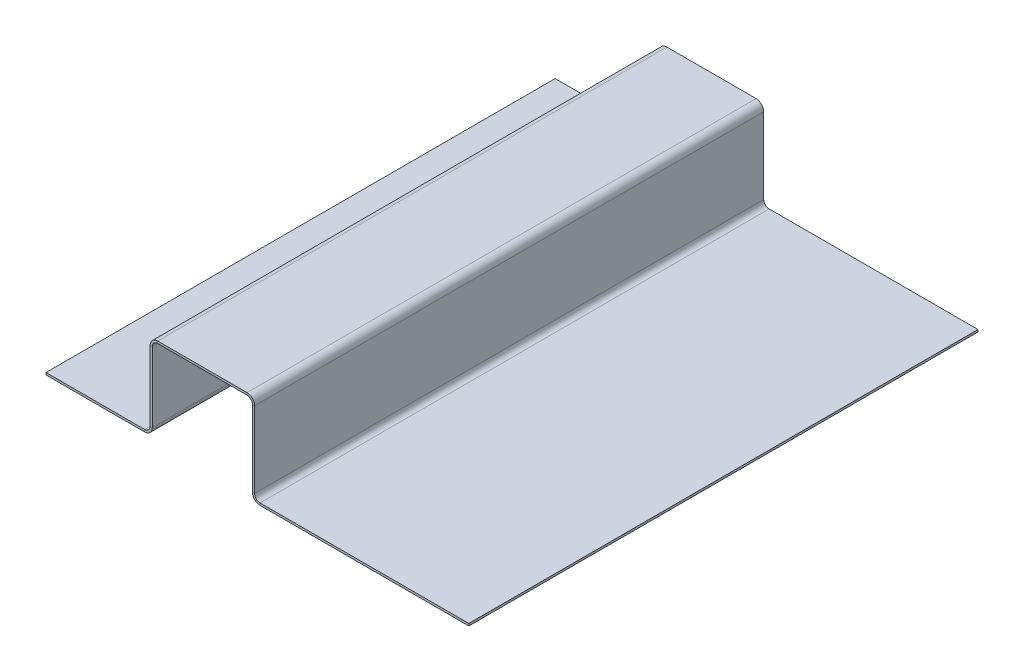
ISO-10303-21;
HEADER;
FILE_DESCRIPTION(('STEP AP214'),'2;1');
FILE_NAME('part.step','',(''),(''),'','','');
FILE_SCHEMA(('AUTOMOTIVE_DESIGN { 1 0 10303 214 1 1 1 1 }'));
ENDSEC;
DATA;
#1=APPLICATION_CONTEXT('core data for automotive mechanical design processes');
#2=APPLICATION_PROTOCOL_DEFINITION('international standard','automotive_design',2000,#1);
#3=PRODUCT_CONTEXT('',#1,'mechanical');
#4=PRODUCT('Part','Part','',(#3));
#5=PRODUCT_RELATED_PRODUCT_CATEGORY('part','',(#4));
#6=PRODUCT_DEFINITION_FORMATION('','',#4);
#7=PRODUCT_DEFINITION_CONTEXT('part definition',#1,'design');
#8=PRODUCT_DEFINITION('design','',#6,#7);
#9=PRODUCT_DEFINITION_SHAPE('','',#8);
#10=(LENGTH_UNIT() NAMED_UNIT(*) SI_UNIT(.MILLI.,.METRE.));
#11=(NAMED_UNIT(*) PLANE_ANGLE_UNIT() SI_UNIT($,.RADIAN.));
#12=(NAMED_UNIT(*) SI_UNIT($,.STERADIAN.) SOLID_ANGLE_UNIT());
#13=UNCERTAINTY_MEASURE_WITH_UNIT(LENGTH_MEASURE(1.E-05),#10,'distance_accuracy_value','');
#14=(GEOMETRIC_REPRESENTATION_CONTEXT(3) GLOBAL_UNCERTAINTY_ASSIGNED_CONTEXT((#13)) GLOBAL_UNIT_ASSIGNED_CONTEXT((#10,
#11,#12)) REPRESENTATION_CONTEXT('',''));
#15=CARTESIAN_POINT('',(0.,0.,0.));
#16=DIRECTION('',(0.,0.,1.));
#17=DIRECTION('',(1.,0.,0.));
#18=AXIS2_PLACEMENT_3D('',#15,#16,#17);
#19=CARTESIAN_POINT('',(-12.4412436176065,5.21604614187182,234.));
#20=DIRECTION('',(0.,0.,1.));
#21=DIRECTION('',(1.,0.,0.));
#22=AXIS2_PLACEMENT_3D('',#19,#20,#21);
#23=PLANE('',#22);
#24=DIRECTION('',(1.,0.,0.));
#25=VECTOR('',#24,1.);
#26=CARTESIAN_POINT('',(-12.4412436176065,5.21604614187182,234.));
#27=LINE('',#26,#25);
#28=CARTESIAN_POINT('',(-12.4412436176065,5.21604614187182,234.));
#29=VERTEX_POINT('',#28);
#30=CARTESIAN_POINT('',(-11.4412436176065,5.21604614187182,234.));
#31=VERTEX_POINT('',#30);
#32=EDGE_CURVE('E11',#29,#31,#27,.T.);
#33=ORIENTED_EDGE('',*,*,#32,.F.);
#34=CARTESIAN_POINT('',(-14.9412436176065,5.21604614187182,234.));
#35=DIRECTION('',(0.,0.,-1.));
#36=DIRECTION('',(-1.,0.,0.));
#37=AXIS2_PLACEMENT_3D('',#34,#35,#36);
#38=CIRCLE('',#37,2.5);
#39=CARTESIAN_POINT('',(-14.9412436176065,2.71604614187182,234.));
#40=VERTEX_POINT('',#39);
#41=EDGE_CURVE('E429',#40,#29,#38,.F.);
#42=ORIENTED_EDGE('',*,*,#41,.F.);
#43=DIRECTION('',(0.,1.,0.));
#44=VECTOR('',#43,1.);
#45=CARTESIAN_POINT('',(-14.9412436176065,1.71604614187182,234.));
#46=LINE('',#45,#44);
#47=CARTESIAN_POINT('',(-14.9412436176065,1.71604614187182,234.));
#48=VERTEX_POINT('',#47);
#49=EDGE_CURVE('E50',#48,#40,#46,.T.);
#50=ORIENTED_EDGE('',*,*,#49,.F.);
#51=CARTESIAN_POINT('',(-14.9412436176065,5.21604614187182,234.));
#52=DIRECTION('',(0.,0.,1.));
#53=DIRECTION('',(1.,0.,0.));
#54=AXIS2_PLACEMENT_3D('',#51,#52,#53);
#55=CIRCLE('',#54,3.5);
#56=EDGE_CURVE('E446',#48,#31,#55,.T.);
#57=ORIENTED_EDGE('',*,*,#56,.T.);
#58=EDGE_LOOP('',(#33,#42,#50,#57));
#59=FACE_BOUND('',#58,.T.);
#60=ADVANCED_FACE('F41',(#59),#23,.T.);
#61=CARTESIAN_POINT('',(-14.9412436176065,1.71604614187182,234.));
#62=DIRECTION('',(0.,0.,1.));
#63=DIRECTION('',(1.,0.,0.));
#64=AXIS2_PLACEMENT_3D('',#61,#62,#63);
#65=PLANE('',#64);
#66=DIRECTION('',(0.,1.,0.));
#67=VECTOR('',#66,1.);
#68=CARTESIAN_POINT('',(-12.4412436176065,2.71604614187182,234.));
#69=LINE('',#68,#67);
#70=CARTESIAN_POINT('',(-12.4412436176065,37.415920911424,234.));
#71=VERTEX_POINT('',#70);
#72=EDGE_CURVE('E434',#29,#71,#69,.T.);
#73=ORIENTED_EDGE('',*,*,#72,.F.);
#74=ORIENTED_EDGE('',*,*,#32,.T.);
#75=DIRECTION('',(0.,1.,0.));
#76=VECTOR('',#75,1.);
#77=CARTESIAN_POINT('',(-11.4412436176065,2.71604614187182,234.));
#78=LINE('',#77,#76);
#79=CARTESIAN_POINT('',(-11.4412436176065,37.415920911424,234.));
#80=VERTEX_POINT('',#79);
#81=EDGE_CURVE('E449',#31,#80,#78,.T.);
#82=ORIENTED_EDGE('',*,*,#81,.T.);
#83=DIRECTION('',(-1.,0.,0.));
#84=VECTOR('',#83,1.);
#85=CARTESIAN_POINT('',(-11.4412436176065,37.415920911424,234.));
#86=LINE('',#85,#84);
#87=EDGE_CURVE('E398',#80,#71,#86,.T.);
#88=ORIENTED_EDGE('',*,*,#87,.T.);
#89=EDGE_LOOP('',(#73,#74,#82,#88));
#90=FACE_BOUND('',#89,.T.);
#91=ADVANCED_FACE('F530',(#90),#65,.T.);
#92=CARTESIAN_POINT('',(-14.9412436176065,2.71604614187182,0.));
#93=DIRECTION('',(0.,0.,-1.));
#94=DIRECTION('',(-1.,0.,0.));
#95=AXIS2_PLACEMENT_3D('',#92,#93,#94);
#96=PLANE('',#95);
#97=DIRECTION('',(0.,-1.,0.));
#98=VECTOR('',#97,1.);
#99=CARTESIAN_POINT('',(-14.9412436176065,2.71604614187182,0.));
#100=LINE('',#99,#98);
#101=CARTESIAN_POINT('',(-14.9412436176065,2.71604614187182,0.));
#102=VERTEX_POINT('',#101);
#103=CARTESIAN_POINT('',(-14.9412436176065,1.71604614187182,0.));
#104=VERTEX_POINT('',#103);
#105=EDGE_CURVE('E407',#102,#104,#100,.T.);
#106=ORIENTED_EDGE('',*,*,#105,.F.);
#107=CARTESIAN_POINT('',(-14.9412436176065,5.21604614187182,0.));
#108=DIRECTION('',(0.,0.,-1.));
#109=DIRECTION('',(-1.,0.,0.));
#110=AXIS2_PLACEMENT_3D('',#107,#108,#109);
#111=CIRCLE('',#110,2.5);
#112=CARTESIAN_POINT('',(-12.4412436176065,5.21604614187182,0.));
#113=VERTEX_POINT('',#112);
#114=EDGE_CURVE('E269',#102,#113,#111,.F.);
#115=ORIENTED_EDGE('',*,*,#114,.T.);
#116=DIRECTION('',(-1.,0.,0.));
#117=VECTOR('',#116,1.);
#118=CARTESIAN_POINT('',(-11.4412436176065,5.21604614187182,0.));
#119=LINE('',#118,#117);
#120=CARTESIAN_POINT('',(-11.4412436176065,5.21604614187182,0.));
#121=VERTEX_POINT('',#120);
#122=EDGE_CURVE('E404',#121,#113,#119,.T.);
#123=ORIENTED_EDGE('',*,*,#122,.F.);
#124=CARTESIAN_POINT('',(-14.9412436176065,5.21604614187182,0.));
#125=DIRECTION('',(0.,0.,1.));
#126=DIRECTION('',(1.,0.,0.));
#127=AXIS2_PLACEMENT_3D('',#124,#125,#126);
#128=CIRCLE('',#127,3.5);
#129=EDGE_CURVE('E285',#104,#121,#128,.T.);
#130=ORIENTED_EDGE('',*,*,#129,.F.);
#131=EDGE_LOOP('',(#106,#115,#123,#130));
#132=FACE_BOUND('',#131,.T.);
#133=ADVANCED_FACE('F572',(#132),#96,.T.);
#134=CARTESIAN_POINT('',(-11.4412436176065,5.21604614187182,0.));
#135=DIRECTION('',(0.,0.,-1.));
#136=DIRECTION('',(-1.,0.,0.));
#137=AXIS2_PLACEMENT_3D('',#134,#135,#136);
#138=PLANE('',#137);
#139=DIRECTION('',(1.,0.,0.));
#140=VECTOR('',#139,1.);
#141=CARTESIAN_POINT('',(-60.27870147122,2.71604614187182,0.));
#142=LINE('',#141,#140);
#143=CARTESIAN_POINT('',(-60.27870147122,2.71604614187182,0.));
#144=VERTEX_POINT('',#143);
#145=EDGE_CURVE('E273',#144,#102,#142,.T.);
#146=ORIENTED_EDGE('',*,*,#145,.T.);
#147=ORIENTED_EDGE('',*,*,#105,.T.);
#148=DIRECTION('',(1.,0.,0.));
#149=VECTOR('',#148,1.);
#150=CARTESIAN_POINT('',(-60.27870147122,1.71604614187182,0.));
#151=LINE('',#150,#149);
#152=CARTESIAN_POINT('',(-60.27870147122,1.71604614187182,0.));
#153=VERTEX_POINT('',#152);
#154=EDGE_CURVE('E281',#153,#104,#151,.T.);
#155=ORIENTED_EDGE('',*,*,#154,.F.);
#156=DIRECTION('',(0.,1.,0.));
#157=VECTOR('',#156,1.);
#158=CARTESIAN_POINT('',(-60.27870147122,1.71604614187182,0.));
#159=LINE('',#158,#157);
#160=EDGE_CURVE('E277',#153,#144,#159,.T.);
#161=ORIENTED_EDGE('',*,*,#160,.T.);
#162=EDGE_LOOP('',(#146,#147,#155,#161));
#163=FACE_BOUND('',#162,.T.);
#164=ADVANCED_FACE('F576',(#163),#138,.T.);
#165=CARTESIAN_POINT('',(-8.94124361760646,40.915920911424,234.));
#166=DIRECTION('',(0.,0.,1.));
#167=DIRECTION('',(1.,0.,0.));
#168=AXIS2_PLACEMENT_3D('',#165,#166,#167);
#169=PLANE('',#168);
#170=DIRECTION('',(0.,-1.,0.));
#171=VECTOR('',#170,1.);
#172=CARTESIAN_POINT('',(-8.94124361760646,40.915920911424,234.));
#173=LINE('',#172,#171);
#174=CARTESIAN_POINT('',(-8.94124361760646,40.915920911424,234.));
#175=VERTEX_POINT('',#174);
#176=CARTESIAN_POINT('',(-8.94124361760646,39.915920911424,234.));
#177=VERTEX_POINT('',#176);
#178=EDGE_CURVE('E401',#175,#177,#173,.T.);
#179=ORIENTED_EDGE('',*,*,#178,.F.);
#180=CARTESIAN_POINT('',(-8.94124361760646,37.415920911424,234.));
#181=DIRECTION('',(0.,0.,1.));
#182=DIRECTION('',(1.,0.,0.));
#183=AXIS2_PLACEMENT_3D('',#180,#181,#182);
#184=CIRCLE('',#183,3.5);
#185=EDGE_CURVE('E518',#71,#175,#184,.F.);
#186=ORIENTED_EDGE('',*,*,#185,.F.);
#187=ORIENTED_EDGE('',*,*,#87,.F.);
#188=CARTESIAN_POINT('',(-8.94124361760646,37.415920911424,234.));
#189=DIRECTION('',(0.,0.,1.));
#190=DIRECTION('',(1.,0.,0.));
#191=AXIS2_PLACEMENT_3D('',#188,#189,#190);
#192=CIRCLE('',#191,2.5);
#193=EDGE_CURVE('E453',#80,#177,#192,.F.);
#194=ORIENTED_EDGE('',*,*,#193,.T.);
#195=EDGE_LOOP('',(#179,#186,#187,#194));
#196=FACE_BOUND('',#195,.T.);
#197=ADVANCED_FACE('F537',(#196),#169,.T.);
#198=CARTESIAN_POINT('',(-11.4412436176065,37.415920911424,234.));
#199=DIRECTION('',(0.,0.,1.));
#200=DIRECTION('',(1.,0.,0.));
#201=AXIS2_PLACEMENT_3D('',#198,#199,#200);
#202=PLANE('',#201);
#203=DIRECTION('',(1.,0.,0.));
#204=VECTOR('',#203,1.);
#205=CARTESIAN_POINT('',(-12.4412436176065,40.915920911424,234.));
#206=LINE('',#205,#204);
#207=CARTESIAN_POINT('',(32.0714430193537,40.915920911424,234.));
#208=VERTEX_POINT('',#207);
#209=EDGE_CURVE('E514',#175,#208,#206,.T.);
#210=ORIENTED_EDGE('',*,*,#209,.F.);
#211=ORIENTED_EDGE('',*,*,#178,.T.);
#212=DIRECTION('',(1.,0.,0.));
#213=VECTOR('',#212,1.);
#214=CARTESIAN_POINT('',(-12.4412436176065,39.915920911424,234.));
#215=LINE('',#214,#213);
#216=CARTESIAN_POINT('',(32.0714430193537,39.915920911424,234.));
#217=VERTEX_POINT('',#216);
#218=EDGE_CURVE('E211',#177,#217,#215,.T.);
#219=ORIENTED_EDGE('',*,*,#218,.T.);
#220=DIRECTION('',(0.,1.,0.));
#221=VECTOR('',#220,1.);
#222=CARTESIAN_POINT('',(32.0714430193537,39.915920911424,234.));
#223=LINE('',#222,#221);
#224=EDGE_CURVE('E201',#217,#208,#223,.T.);
#225=ORIENTED_EDGE('',*,*,#224,.T.);
#226=EDGE_LOOP('',(#210,#211,#219,#225));
#227=FACE_BOUND('',#226,.T.);
#228=ADVANCED_FACE('F461',(#227),#202,.T.);
#229=CARTESIAN_POINT('',(-12.4412436176065,37.415920911424,0.));
#230=DIRECTION('',(0.,0.,-1.));
#231=DIRECTION('',(-1.,0.,0.));
#232=AXIS2_PLACEMENT_3D('',#229,#230,#231);
#233=PLANE('',#232);
#234=DIRECTION('',(1.,0.,0.));
#235=VECTOR('',#234,1.);
#236=CARTESIAN_POINT('',(-12.4412436176065,37.415920911424,0.));
#237=LINE('',#236,#235);
#238=CARTESIAN_POINT('',(-12.4412436176065,37.415920911424,0.));
#239=VERTEX_POINT('',#238);
#240=CARTESIAN_POINT('',(-11.4412436176065,37.415920911424,0.));
#241=VERTEX_POINT('',#240);
#242=EDGE_CURVE('E395',#239,#241,#237,.T.);
#243=ORIENTED_EDGE('',*,*,#242,.F.);
#244=CARTESIAN_POINT('',(-8.94124361760646,37.415920911424,0.));
#245=DIRECTION('',(0.,0.,1.));
#246=DIRECTION('',(1.,0.,0.));
#247=AXIS2_PLACEMENT_3D('',#244,#245,#246);
#248=CIRCLE('',#247,3.5);
#249=CARTESIAN_POINT('',(-8.94124361760646,40.915920911424,0.));
#250=VERTEX_POINT('',#249);
#251=EDGE_CURVE('E261',#239,#250,#248,.F.);
#252=ORIENTED_EDGE('',*,*,#251,.T.);
#253=DIRECTION('',(0.,1.,0.));
#254=VECTOR('',#253,1.);
#255=CARTESIAN_POINT('',(-8.94124361760646,39.915920911424,0.));
#256=LINE('',#255,#254);
#257=CARTESIAN_POINT('',(-8.94124361760646,39.915920911424,0.));
#258=VERTEX_POINT('',#257);
#259=EDGE_CURVE('E200',#258,#250,#256,.T.);
#260=ORIENTED_EDGE('',*,*,#259,.F.);
#261=CARTESIAN_POINT('',(-8.94124361760646,37.415920911424,0.));
#262=DIRECTION('',(0.,0.,1.));
#263=DIRECTION('',(1.,0.,0.));
#264=AXIS2_PLACEMENT_3D('',#261,#262,#263);
#265=CIRCLE('',#264,2.5);
#266=EDGE_CURVE('E293',#241,#258,#265,.F.);
#267=ORIENTED_EDGE('',*,*,#266,.F.);
#268=EDGE_LOOP('',(#243,#252,#260,#267));
#269=FACE_BOUND('',#268,.T.);
#270=ADVANCED_FACE('F546',(#269),#233,.T.);
#271=CARTESIAN_POINT('',(-8.94124361760646,39.915920911424,0.));
#272=DIRECTION('',(0.,0.,-1.));
#273=DIRECTION('',(-1.,0.,0.));
#274=AXIS2_PLACEMENT_3D('',#271,#272,#273);
#275=PLANE('',#274);
#276=DIRECTION('',(0.,1.,0.));
#277=VECTOR('',#276,1.);
#278=CARTESIAN_POINT('',(-12.4412436176065,2.71604614187182,0.));
#279=LINE('',#278,#277);
#280=EDGE_CURVE('E265',#113,#239,#279,.T.);
#281=ORIENTED_EDGE('',*,*,#280,.T.);
#282=ORIENTED_EDGE('',*,*,#242,.T.);
#283=DIRECTION('',(0.,1.,0.));
#284=VECTOR('',#283,1.);
#285=CARTESIAN_POINT('',(-11.4412436176065,2.71604614187182,0.));
#286=LINE('',#285,#284);
#287=EDGE_CURVE('E289',#121,#241,#286,.T.);
#288=ORIENTED_EDGE('',*,*,#287,.F.);
#289=ORIENTED_EDGE('',*,*,#122,.T.);
#290=EDGE_LOOP('',(#281,#282,#288,#289));
#291=FACE_BOUND('',#290,.T.);
#292=ADVANCED_FACE('F550',(#291),#275,.T.);
#293=CARTESIAN_POINT('',(35.5714430193537,37.415920911424,234.));
#294=DIRECTION('',(0.,0.,1.));
#295=DIRECTION('',(1.,0.,0.));
#296=AXIS2_PLACEMENT_3D('',#293,#294,#295);
#297=PLANE('',#296);
#298=DIRECTION('',(-1.,0.,0.));
#299=VECTOR('',#298,1.);
#300=CARTESIAN_POINT('',(35.5714430193537,37.415920911424,234.));
#301=LINE('',#300,#299);
#302=CARTESIAN_POINT('',(35.5714430193537,37.415920911424,234.));
#303=VERTEX_POINT('',#302);
#304=CARTESIAN_POINT('',(34.5714430193537,37.415920911424,234.));
#305=VERTEX_POINT('',#304);
#306=EDGE_CURVE('E187',#303,#305,#301,.T.);
#307=ORIENTED_EDGE('',*,*,#306,.F.);
#308=CARTESIAN_POINT('',(32.0714430193537,37.415920911424,234.));
#309=DIRECTION('',(0.,0.,1.));
#310=DIRECTION('',(1.,0.,0.));
#311=AXIS2_PLACEMENT_3D('',#308,#309,#310);
#312=CIRCLE('',#311,3.5);
#313=EDGE_CURVE('E473',#208,#303,#312,.F.);
#314=ORIENTED_EDGE('',*,*,#313,.F.);
#315=ORIENTED_EDGE('',*,*,#224,.F.);
#316=CARTESIAN_POINT('',(32.0714430193537,37.415920911424,234.));
#317=DIRECTION('',(0.,0.,1.));
#318=DIRECTION('',(1.,0.,0.));
#319=AXIS2_PLACEMENT_3D('',#316,#317,#318);
#320=CIRCLE('',#319,2.5);
#321=EDGE_CURVE('E204',#217,#305,#320,.F.);
#322=ORIENTED_EDGE('',*,*,#321,.T.);
#323=EDGE_LOOP('',(#307,#314,#315,#322));
#324=FACE_BOUND('',#323,.T.);
#325=ADVANCED_FACE('F206',(#324),#297,.T.);
#326=CARTESIAN_POINT('',(32.0714430193537,39.915920911424,234.));
#327=DIRECTION('',(0.,0.,1.));
#328=DIRECTION('',(1.,0.,0.));
#329=AXIS2_PLACEMENT_3D('',#326,#327,#328);
#330=PLANE('',#329);
#331=DIRECTION('',(0.,-1.,0.));
#332=VECTOR('',#331,1.);
#333=CARTESIAN_POINT('',(35.5714430193537,40.915920911424,234.));
#334=LINE('',#333,#332);
#335=CARTESIAN_POINT('',(35.5714430193537,2.50000000000004,234.));
#336=VERTEX_POINT('',#335);
#337=EDGE_CURVE('E194',#303,#336,#334,.T.);
#338=ORIENTED_EDGE('',*,*,#337,.F.);
#339=ORIENTED_EDGE('',*,*,#306,.T.);
#340=DIRECTION('',(0.,1.,0.));
#341=VECTOR('',#340,1.);
#342=CARTESIAN_POINT('',(34.5714430193537,40.915920911424,234.));
#343=LINE('',#342,#341);
#344=CARTESIAN_POINT('',(34.5714430193537,2.50000000000005,234.));
#345=VERTEX_POINT('',#344);
#346=EDGE_CURVE('E191',#305,#345,#343,.F.);
#347=ORIENTED_EDGE('',*,*,#346,.T.);
#348=DIRECTION('',(1.,0.,0.));
#349=VECTOR('',#348,1.);
#350=CARTESIAN_POINT('',(34.5714430193537,2.50000000000005,234.));
#351=LINE('',#350,#349);
#352=EDGE_CURVE('E380',#345,#336,#351,.T.);
#353=ORIENTED_EDGE('',*,*,#352,.T.);
#354=EDGE_LOOP('',(#338,#339,#347,#353));
#355=FACE_BOUND('',#354,.T.);
#356=ADVANCED_FACE('F189',(#355),#330,.T.);
#357=CARTESIAN_POINT('',(32.0714430193537,40.915920911424,0.));
#358=DIRECTION('',(0.,0.,-1.));
#359=DIRECTION('',(-1.,0.,0.));
#360=AXIS2_PLACEMENT_3D('',#357,#358,#359);
#361=PLANE('',#360);
#362=DIRECTION('',(0.,-1.,0.));
#363=VECTOR('',#362,1.);
#364=CARTESIAN_POINT('',(32.0714430193537,40.915920911424,0.));
#365=LINE('',#364,#363);
#366=CARTESIAN_POINT('',(32.0714430193537,40.915920911424,0.));
#367=VERTEX_POINT('',#366);
#368=CARTESIAN_POINT('',(32.0714430193537,39.915920911424,0.));
#369=VERTEX_POINT('',#368);
#370=EDGE_CURVE('E388',#367,#369,#365,.T.);
#371=ORIENTED_EDGE('',*,*,#370,.F.);
#372=CARTESIAN_POINT('',(32.0714430193537,37.415920911424,0.));
#373=DIRECTION('',(0.,0.,1.));
#374=DIRECTION('',(1.,0.,0.));
#375=AXIS2_PLACEMENT_3D('',#372,#373,#374);
#376=CIRCLE('',#375,3.5);
#377=CARTESIAN_POINT('',(35.5714430193537,37.415920911424,0.));
#378=VERTEX_POINT('',#377);
#379=EDGE_CURVE('E253',#367,#378,#376,.F.);
#380=ORIENTED_EDGE('',*,*,#379,.T.);
#381=DIRECTION('',(1.,0.,0.));
#382=VECTOR('',#381,1.);
#383=CARTESIAN_POINT('',(34.5714430193537,37.415920911424,0.));
#384=LINE('',#383,#382);
#385=CARTESIAN_POINT('',(34.5714430193537,37.415920911424,0.));
#386=VERTEX_POINT('',#385);
#387=EDGE_CURVE('E385',#386,#378,#384,.T.);
#388=ORIENTED_EDGE('',*,*,#387,.F.);
#389=CARTESIAN_POINT('',(32.0714430193537,37.415920911424,0.));
#390=DIRECTION('',(0.,0.,1.));
#391=DIRECTION('',(1.,0.,0.));
#392=AXIS2_PLACEMENT_3D('',#389,#390,#391);
#393=CIRCLE('',#392,2.5);
#394=EDGE_CURVE('E218',#369,#386,#393,.F.);
#395=ORIENTED_EDGE('',*,*,#394,.F.);
#396=EDGE_LOOP('',(#371,#380,#388,#395));
#397=FACE_BOUND('',#396,.T.);
#398=ADVANCED_FACE('F467',(#397),#361,.T.);
#399=CARTESIAN_POINT('',(34.5714430193537,37.415920911424,0.));
#400=DIRECTION('',(0.,0.,-1.));
#401=DIRECTION('',(-1.,0.,0.));
#402=AXIS2_PLACEMENT_3D('',#399,#400,#401);
#403=PLANE('',#402);
#404=DIRECTION('',(1.,0.,0.));
#405=VECTOR('',#404,1.);
#406=CARTESIAN_POINT('',(-12.4412436176065,40.915920911424,0.));
#407=LINE('',#406,#405);
#408=EDGE_CURVE('E257',#250,#367,#407,.T.);
#409=ORIENTED_EDGE('',*,*,#408,.T.);
#410=ORIENTED_EDGE('',*,*,#370,.T.);
#411=DIRECTION('',(1.,0.,0.));
#412=VECTOR('',#411,1.);
#413=CARTESIAN_POINT('',(-12.4412436176065,39.915920911424,0.));
#414=LINE('',#413,#412);
#415=EDGE_CURVE('E297',#258,#369,#414,.T.);
#416=ORIENTED_EDGE('',*,*,#415,.F.);
#417=ORIENTED_EDGE('',*,*,#259,.T.);
#418=EDGE_LOOP('',(#409,#410,#416,#417));
#419=FACE_BOUND('',#418,.T.);
#420=ADVANCED_FACE('F556',(#419),#403,.T.);
#421=CARTESIAN_POINT('',(38.0714430193537,0.,234.));
#422=DIRECTION('',(0.,0.,1.));
#423=DIRECTION('',(1.,0.,0.));
#424=AXIS2_PLACEMENT_3D('',#421,#422,#423);
#425=PLANE('',#424);
#426=DIRECTION('',(0.,-1.,0.));
#427=VECTOR('',#426,1.);
#428=CARTESIAN_POINT('',(38.0714430193537,0.,234.));
#429=LINE('',#428,#427);
#430=CARTESIAN_POINT('',(38.0714430193537,0.,234.));
#431=VERTEX_POINT('',#430);
#432=CARTESIAN_POINT('',(38.0714430193537,-1.,234.));
#433=VERTEX_POINT('',#432);
#434=EDGE_CURVE('E58',#431,#433,#429,.T.);
#435=ORIENTED_EDGE('',*,*,#434,.F.);
#436=CARTESIAN_POINT('',(38.0714430193537,2.50000000000001,234.));
#437=DIRECTION('',(0.,0.,-1.));
#438=DIRECTION('',(-1.,0.,0.));
#439=AXIS2_PLACEMENT_3D('',#436,#437,#438);
#440=CIRCLE('',#439,2.5);
#441=EDGE_CURVE('E504',#336,#431,#440,.F.);
#442=ORIENTED_EDGE('',*,*,#441,.F.);
#443=ORIENTED_EDGE('',*,*,#352,.F.);
#444=CARTESIAN_POINT('',(38.0714430193537,2.50000000000001,234.));
#445=DIRECTION('',(0.,0.,1.));
#446=DIRECTION('',(1.,0.,0.));
#447=AXIS2_PLACEMENT_3D('',#444,#445,#446);
#448=CIRCLE('',#447,3.5);
#449=EDGE_CURVE('E228',#345,#433,#448,.T.);
#450=ORIENTED_EDGE('',*,*,#449,.T.);
#451=EDGE_LOOP('',(#435,#442,#443,#450));
#452=FACE_BOUND('',#451,.T.);
#453=ADVANCED_FACE('F558',(#452),#425,.T.);
#454=CARTESIAN_POINT('',(34.5714430193537,2.50000000000005,234.));
#455=DIRECTION('',(0.,0.,1.));
#456=DIRECTION('',(1.,0.,0.));
#457=AXIS2_PLACEMENT_3D('',#454,#455,#456);
#458=PLANE('',#457);
#459=DIRECTION('',(1.,0.,0.));
#460=VECTOR('',#459,1.);
#461=CARTESIAN_POINT('',(35.5714430193537,0.,234.));
#462=LINE('',#461,#460);
#463=CARTESIAN_POINT('',(134.050019260126,0.,234.));
#464=VERTEX_POINT('',#463);
#465=EDGE_CURVE('E500',#431,#464,#462,.T.);
#466=ORIENTED_EDGE('',*,*,#465,.F.);
#467=ORIENTED_EDGE('',*,*,#434,.T.);
#468=DIRECTION('',(1.,0.,0.));
#469=VECTOR('',#468,1.);
#470=CARTESIAN_POINT('',(35.5714430193537,-1.,234.));
#471=LINE('',#470,#469);
#472=CARTESIAN_POINT('',(134.050019260126,-1.,234.));
#473=VERTEX_POINT('',#472);
#474=EDGE_CURVE('E136',#433,#473,#471,.T.);
#475=ORIENTED_EDGE('',*,*,#474,.T.);
#476=DIRECTION('',(0.,-1.,0.));
#477=VECTOR('',#476,1.);
#478=CARTESIAN_POINT('',(134.050019260126,0.,234.));
#479=LINE('',#478,#477);
#480=EDGE_CURVE('E497',#464,#473,#479,.T.);
#481=ORIENTED_EDGE('',*,*,#480,.F.);
#482=EDGE_LOOP('',(#466,#467,#475,#481));
#483=FACE_BOUND('',#482,.T.);
#484=ADVANCED_FACE('F564',(#483),#458,.T.);
#485=CARTESIAN_POINT('',(35.5714430193537,2.50000000000004,0.));
#486=DIRECTION('',(0.,0.,-1.));
#487=DIRECTION('',(-1.,0.,0.));
#488=AXIS2_PLACEMENT_3D('',#485,#486,#487);
#489=PLANE('',#488);
#490=DIRECTION('',(-1.,0.,0.));
#491=VECTOR('',#490,1.);
#492=CARTESIAN_POINT('',(35.5714430193537,2.50000000000004,0.));
#493=LINE('',#492,#491);
#494=CARTESIAN_POINT('',(35.5714430193537,2.50000000000004,0.));
#495=VERTEX_POINT('',#494);
#496=CARTESIAN_POINT('',(34.5714430193537,2.50000000000005,0.));
#497=VERTEX_POINT('',#496);
#498=EDGE_CURVE('E123',#495,#497,#493,.T.);
#499=ORIENTED_EDGE('',*,*,#498,.F.);
#500=CARTESIAN_POINT('',(38.0714430193537,2.50000000000001,0.));
#501=DIRECTION('',(0.,0.,-1.));
#502=DIRECTION('',(-1.,0.,0.));
#503=AXIS2_PLACEMENT_3D('',#500,#501,#502);
#504=CIRCLE('',#503,2.5);
#505=CARTESIAN_POINT('',(38.0714430193537,0.,0.));
#506=VERTEX_POINT('',#505);
#507=EDGE_CURVE('E247',#495,#506,#504,.F.);
#508=ORIENTED_EDGE('',*,*,#507,.T.);
#509=DIRECTION('',(0.,1.,0.));
#510=VECTOR('',#509,1.);
#511=CARTESIAN_POINT('',(38.0714430193537,-1.,0.));
#512=LINE('',#511,#510);
#513=CARTESIAN_POINT('',(38.0714430193537,-1.,0.));
#514=VERTEX_POINT('',#513);
#515=EDGE_CURVE('E130',#514,#506,#512,.T.);
#516=ORIENTED_EDGE('',*,*,#515,.F.);
#517=CARTESIAN_POINT('',(38.0714430193537,2.50000000000001,0.));
#518=DIRECTION('',(0.,0.,1.));
#519=DIRECTION('',(1.,0.,0.));
#520=AXIS2_PLACEMENT_3D('',#517,#518,#519);
#521=CIRCLE('',#520,3.5);
#522=EDGE_CURVE('E306',#497,#514,#521,.T.);
#523=ORIENTED_EDGE('',*,*,#522,.F.);
#524=EDGE_LOOP('',(#499,#508,#516,#523));
#525=FACE_BOUND('',#524,.T.);
#526=ADVANCED_FACE('F484',(#525),#489,.T.);
#527=CARTESIAN_POINT('',(38.0714430193537,-1.,0.));
#528=DIRECTION('',(0.,0.,-1.));
#529=DIRECTION('',(-1.,0.,0.));
#530=AXIS2_PLACEMENT_3D('',#527,#528,#529);
#531=PLANE('',#530);
#532=DIRECTION('',(0.,-1.,0.));
#533=VECTOR('',#532,1.);
#534=CARTESIAN_POINT('',(35.5714430193537,40.915920911424,0.));
#535=LINE('',#534,#533);
#536=EDGE_CURVE('E250',#378,#495,#535,.T.);
#537=ORIENTED_EDGE('',*,*,#536,.T.);
#538=ORIENTED_EDGE('',*,*,#498,.T.);
#539=DIRECTION('',(0.,1.,0.));
#540=VECTOR('',#539,1.);
#541=CARTESIAN_POINT('',(34.5714430193537,40.915920911424,0.));
#542=LINE('',#541,#540);
#543=EDGE_CURVE('E303',#386,#497,#542,.F.);
#544=ORIENTED_EDGE('',*,*,#543,.F.);
#545=ORIENTED_EDGE('',*,*,#387,.T.);
#546=EDGE_LOOP('',(#537,#538,#544,#545));
#547=FACE_BOUND('',#546,.T.);
#548=ADVANCED_FACE('F469',(#547),#531,.T.);
#549=CARTESIAN_POINT('',(35.5714430193537,-1.,234.));
#550=DIRECTION('',(0.,1.,0.));
#551=DIRECTION('',(0.,0.,1.));
#552=AXIS2_PLACEMENT_3D('',#549,#550,#551);
#553=PLANE('',#552);
#554=DIRECTION('',(1.,0.,0.));
#555=VECTOR('',#554,1.);
#556=CARTESIAN_POINT('',(35.5714430193537,-1.,0.));
#557=LINE('',#556,#555);
#558=CARTESIAN_POINT('',(134.050019260126,-1.,0.));
#559=VERTEX_POINT('',#558);
#560=EDGE_CURVE('E235',#514,#559,#557,.T.);
#561=ORIENTED_EDGE('',*,*,#560,.T.);
#562=DIRECTION('',(0.,0.,-1.));
#563=VECTOR('',#562,1.);
#564=CARTESIAN_POINT('',(134.050019260126,-1.,234.));
#565=LINE('',#564,#563);
#566=EDGE_CURVE('E373',#473,#559,#565,.T.);
#567=ORIENTED_EDGE('',*,*,#566,.F.);
#568=ORIENTED_EDGE('',*,*,#474,.F.);
#569=DIRECTION('',(0.,0.,-1.));
#570=VECTOR('',#569,1.);
#571=CARTESIAN_POINT('',(38.0714430193537,-1.,234.));
#572=LINE('',#571,#570);
#573=EDGE_CURVE('E231',#433,#514,#572,.T.);
#574=ORIENTED_EDGE('',*,*,#573,.T.);
#575=EDGE_LOOP('',(#561,#567,#568,#574));
#576=FACE_BOUND('',#575,.T.);
#577=ADVANCED_FACE('F490',(#576),#553,.F.);
#578=CARTESIAN_POINT('',(134.050019260126,0.,234.));
#579=DIRECTION('',(1.,0.,0.));
#580=DIRECTION('',(0.,0.,-1.));
#581=AXIS2_PLACEMENT_3D('',#578,#579,#580);
#582=PLANE('',#581);
#583=DIRECTION('',(0.,-1.,0.));
#584=VECTOR('',#583,1.);
#585=CARTESIAN_POINT('',(134.050019260126,0.,0.));
#586=LINE('',#585,#584);
#587=CARTESIAN_POINT('',(134.050019260126,0.,0.));
#588=VERTEX_POINT('',#587);
#589=EDGE_CURVE('E239',#588,#559,#586,.T.);
#590=ORIENTED_EDGE('',*,*,#589,.F.);
#591=DIRECTION('',(0.,0.,-1.));
#592=VECTOR('',#591,1.);
#593=CARTESIAN_POINT('',(134.050019260126,0.,234.));
#594=LINE('',#593,#592);
#595=EDGE_CURVE('E370',#464,#588,#594,.T.);
#596=ORIENTED_EDGE('',*,*,#595,.F.);
#597=ORIENTED_EDGE('',*,*,#480,.T.);
#598=ORIENTED_EDGE('',*,*,#566,.T.);
#599=EDGE_LOOP('',(#590,#596,#597,#598));
#600=FACE_BOUND('',#599,.T.);
#601=ADVANCED_FACE('F495',(#600),#582,.T.);
#602=CARTESIAN_POINT('',(35.5714430193537,0.,234.));
#603=DIRECTION('',(0.,1.,0.));
#604=DIRECTION('',(0.,0.,1.));
#605=AXIS2_PLACEMENT_3D('',#602,#603,#604);
#606=PLANE('',#605);
#607=DIRECTION('',(1.,0.,0.));
#608=VECTOR('',#607,1.);
#609=CARTESIAN_POINT('',(35.5714430193537,0.,0.));
#610=LINE('',#609,#608);
#611=EDGE_CURVE('E243',#506,#588,#610,.T.);
#612=ORIENTED_EDGE('',*,*,#611,.F.);
#613=DIRECTION('',(0.,0.,-1.));
#614=VECTOR('',#613,1.);
#615=CARTESIAN_POINT('',(38.0714430193537,0.,234.));
#616=LINE('',#615,#614);
#617=EDGE_CURVE('E366',#431,#506,#616,.T.);
#618=ORIENTED_EDGE('',*,*,#617,.F.);
#619=ORIENTED_EDGE('',*,*,#465,.T.);
#620=ORIENTED_EDGE('',*,*,#595,.T.);
#621=EDGE_LOOP('',(#612,#618,#619,#620));
#622=FACE_BOUND('',#621,.T.);
#623=ADVANCED_FACE('F660',(#622),#606,.T.);
#624=CARTESIAN_POINT('',(38.0714430193537,2.50000000000001,234.));
#625=DIRECTION('',(0.,0.,-1.));
#626=DIRECTION('',(-1.,0.,0.));
#627=AXIS2_PLACEMENT_3D('',#624,#625,#626);
#628=CYLINDRICAL_SURFACE('',#627,2.5);
#629=ORIENTED_EDGE('',*,*,#507,.F.);
#630=DIRECTION('',(0.,0.,-1.));
#631=VECTOR('',#630,1.);
#632=CARTESIAN_POINT('',(35.5714430193537,2.50000000000004,234.));
#633=LINE('',#632,#631);
#634=EDGE_CURVE('E362',#336,#495,#633,.T.);
#635=ORIENTED_EDGE('',*,*,#634,.F.);
#636=ORIENTED_EDGE('',*,*,#441,.T.);
#637=ORIENTED_EDGE('',*,*,#617,.T.);
#638=EDGE_LOOP('',(#629,#635,#636,#637));
#639=FACE_BOUND('',#638,.T.);
#640=ADVANCED_FACE('F481',(#639),#628,.F.);
#641=CARTESIAN_POINT('',(35.5714430193537,40.915920911424,234.));
#642=DIRECTION('',(1.,0.,0.));
#643=DIRECTION('',(0.,0.,-1.));
#644=AXIS2_PLACEMENT_3D('',#641,#642,#643);
#645=PLANE('',#644);
#646=ORIENTED_EDGE('',*,*,#536,.F.);
#647=DIRECTION('',(0.,0.,-1.));
#648=VECTOR('',#647,1.);
#649=CARTESIAN_POINT('',(35.5714430193537,37.415920911424,234.));
#650=LINE('',#649,#648);
#651=EDGE_CURVE('E358',#303,#378,#650,.T.);
#652=ORIENTED_EDGE('',*,*,#651,.F.);
#653=ORIENTED_EDGE('',*,*,#337,.T.);
#654=ORIENTED_EDGE('',*,*,#634,.T.);
#655=EDGE_LOOP('',(#646,#652,#653,#654));
#656=FACE_BOUND('',#655,.T.);
#657=ADVANCED_FACE('F475',(#656),#645,.T.);
#658=CARTESIAN_POINT('',(32.0714430193537,37.415920911424,234.));
#659=DIRECTION('',(0.,0.,-1.));
#660=DIRECTION('',(-1.,0.,0.));
#661=AXIS2_PLACEMENT_3D('',#658,#659,#660);
#662=CYLINDRICAL_SURFACE('',#661,3.5);
#663=ORIENTED_EDGE('',*,*,#379,.F.);
#664=DIRECTION('',(0.,0.,-1.));
#665=VECTOR('',#664,1.);
#666=CARTESIAN_POINT('',(32.0714430193537,40.915920911424,234.));
#667=LINE('',#666,#665);
#668=EDGE_CURVE('E354',#208,#367,#667,.T.);
#669=ORIENTED_EDGE('',*,*,#668,.F.);
#670=ORIENTED_EDGE('',*,*,#313,.T.);
#671=ORIENTED_EDGE('',*,*,#651,.T.);
#672=EDGE_LOOP('',(#663,#669,#670,#671));
#673=FACE_BOUND('',#672,.T.);
#674=ADVANCED_FACE('F472',(#673),#662,.T.);
#675=CARTESIAN_POINT('',(-12.4412436176065,40.915920911424,234.));
#676=DIRECTION('',(0.,1.,0.));
#677=DIRECTION('',(0.,0.,1.));
#678=AXIS2_PLACEMENT_3D('',#675,#676,#677);
#679=PLANE('',#678);
#680=ORIENTED_EDGE('',*,*,#408,.F.);
#681=DIRECTION('',(0.,0.,-1.));
#682=VECTOR('',#681,1.);
#683=CARTESIAN_POINT('',(-8.94124361760646,40.915920911424,234.));
#684=LINE('',#683,#682);
#685=EDGE_CURVE('E350',#175,#250,#684,.T.);
#686=ORIENTED_EDGE('',*,*,#685,.F.);
#687=ORIENTED_EDGE('',*,*,#209,.T.);
#688=ORIENTED_EDGE('',*,*,#668,.T.);
#689=EDGE_LOOP('',(#680,#686,#687,#688));
#690=FACE_BOUND('',#689,.T.);
#691=ADVANCED_FACE('F543',(#690),#679,.T.);
#692=CARTESIAN_POINT('',(-8.94124361760646,37.415920911424,234.));
#693=DIRECTION('',(0.,0.,-1.));
#694=DIRECTION('',(-1.,0.,0.));
#695=AXIS2_PLACEMENT_3D('',#692,#693,#694);
#696=CYLINDRICAL_SURFACE('',#695,3.5);
#697=ORIENTED_EDGE('',*,*,#251,.F.);
#698=DIRECTION('',(0.,0.,-1.));
#699=VECTOR('',#698,1.);
#700=CARTESIAN_POINT('',(-12.4412436176065,37.415920911424,234.));
#701=LINE('',#700,#699);
#702=EDGE_CURVE('E346',#71,#239,#701,.T.);
#703=ORIENTED_EDGE('',*,*,#702,.F.);
#704=ORIENTED_EDGE('',*,*,#185,.T.);
#705=ORIENTED_EDGE('',*,*,#685,.T.);
#706=EDGE_LOOP('',(#697,#703,#704,#705));
#707=FACE_BOUND('',#706,.T.);
#708=ADVANCED_FACE('F536',(#707),#696,.T.);
#709=CARTESIAN_POINT('',(-12.4412436176065,2.71604614187182,234.));
#710=DIRECTION('',(-1.,0.,0.));
#711=DIRECTION('',(0.,0.,1.));
#712=AXIS2_PLACEMENT_3D('',#709,#710,#711);
#713=PLANE('',#712);
#714=ORIENTED_EDGE('',*,*,#280,.F.);
#715=DIRECTION('',(0.,0.,-1.));
#716=VECTOR('',#715,1.);
#717=CARTESIAN_POINT('',(-12.4412436176065,5.21604614187182,234.));
#718=LINE('',#717,#716);
#719=EDGE_CURVE('E342',#29,#113,#718,.T.);
#720=ORIENTED_EDGE('',*,*,#719,.F.);
#721=ORIENTED_EDGE('',*,*,#72,.T.);
#722=ORIENTED_EDGE('',*,*,#702,.T.);
#723=EDGE_LOOP('',(#714,#720,#721,#722));
#724=FACE_BOUND('',#723,.T.);
#725=ADVANCED_FACE('F526',(#724),#713,.T.);
#726=CARTESIAN_POINT('',(-14.9412436176065,5.21604614187182,234.));
#727=DIRECTION('',(0.,0.,-1.));
#728=DIRECTION('',(-1.,0.,0.));
#729=AXIS2_PLACEMENT_3D('',#726,#727,#728);
#730=CYLINDRICAL_SURFACE('',#729,2.5);
#731=ORIENTED_EDGE('',*,*,#114,.F.);
#732=DIRECTION('',(0.,0.,-1.));
#733=VECTOR('',#732,1.);
#734=CARTESIAN_POINT('',(-14.9412436176065,2.71604614187182,234.));
#735=LINE('',#734,#733);
#736=EDGE_CURVE('E338',#40,#102,#735,.T.);
#737=ORIENTED_EDGE('',*,*,#736,.F.);
#738=ORIENTED_EDGE('',*,*,#41,.T.);
#739=ORIENTED_EDGE('',*,*,#719,.T.);
#740=EDGE_LOOP('',(#731,#737,#738,#739));
#741=FACE_BOUND('',#740,.T.);
#742=ADVANCED_FACE('F428',(#741),#730,.F.);
#743=CARTESIAN_POINT('',(-60.27870147122,2.71604614187182,234.));
#744=DIRECTION('',(0.,1.,0.));
#745=DIRECTION('',(0.,0.,1.));
#746=AXIS2_PLACEMENT_3D('',#743,#744,#745);
#747=PLANE('',#746);
#748=ORIENTED_EDGE('',*,*,#145,.F.);
#749=DIRECTION('',(0.,0.,-1.));
#750=VECTOR('',#749,1.);
#751=CARTESIAN_POINT('',(-60.27870147122,2.71604614187182,234.));
#752=LINE('',#751,#750);
#753=CARTESIAN_POINT('',(-60.27870147122,2.71604614187182,234.));
#754=VERTEX_POINT('',#753);
#755=EDGE_CURVE('E335',#754,#144,#752,.T.);
#756=ORIENTED_EDGE('',*,*,#755,.F.);
#757=DIRECTION('',(1.,0.,0.));
#758=VECTOR('',#757,1.);
#759=CARTESIAN_POINT('',(-60.27870147122,2.71604614187182,234.));
#760=LINE('',#759,#758);
#761=EDGE_CURVE('E417',#754,#40,#760,.T.);
#762=ORIENTED_EDGE('',*,*,#761,.T.);
#763=ORIENTED_EDGE('',*,*,#736,.T.);
#764=EDGE_LOOP('',(#748,#756,#762,#763));
#765=FACE_BOUND('',#764,.T.);
#766=ADVANCED_FACE('F436',(#765),#747,.T.);
#767=CARTESIAN_POINT('',(-60.27870147122,1.71604614187182,234.));
#768=DIRECTION('',(-1.,0.,0.));
#769=DIRECTION('',(0.,0.,1.));
#770=AXIS2_PLACEMENT_3D('',#767,#768,#769);
#771=PLANE('',#770);
#772=ORIENTED_EDGE('',*,*,#160,.F.);
#773=DIRECTION('',(0.,0.,-1.));
#774=VECTOR('',#773,1.);
#775=CARTESIAN_POINT('',(-60.27870147122,1.71604614187182,234.));
#776=LINE('',#775,#774);
#777=CARTESIAN_POINT('',(-60.27870147122,1.71604614187182,234.));
#778=VERTEX_POINT('',#777);
#779=EDGE_CURVE('E332',#778,#153,#776,.T.);
#780=ORIENTED_EDGE('',*,*,#779,.F.);
#781=DIRECTION('',(0.,1.,0.));
#782=VECTOR('',#781,1.);
#783=CARTESIAN_POINT('',(-60.27870147122,1.71604614187182,234.));
#784=LINE('',#783,#782);
#785=EDGE_CURVE('E438',#778,#754,#784,.T.);
#786=ORIENTED_EDGE('',*,*,#785,.T.);
#787=ORIENTED_EDGE('',*,*,#755,.T.);
#788=EDGE_LOOP('',(#772,#780,#786,#787));
#789=FACE_BOUND('',#788,.T.);
#790=ADVANCED_FACE('F743',(#789),#771,.T.);
#791=CARTESIAN_POINT('',(-60.27870147122,1.71604614187182,234.));
#792=DIRECTION('',(0.,1.,0.));
#793=DIRECTION('',(0.,0.,1.));
#794=AXIS2_PLACEMENT_3D('',#791,#792,#793);
#795=PLANE('',#794);
#796=ORIENTED_EDGE('',*,*,#154,.T.);
#797=DIRECTION('',(0.,0.,-1.));
#798=VECTOR('',#797,1.);
#799=CARTESIAN_POINT('',(-14.9412436176065,1.71604614187182,234.));
#800=LINE('',#799,#798);
#801=EDGE_CURVE('E328',#48,#104,#800,.T.);
#802=ORIENTED_EDGE('',*,*,#801,.F.);
#803=DIRECTION('',(1.,0.,0.));
#804=VECTOR('',#803,1.);
#805=CARTESIAN_POINT('',(-60.27870147122,1.71604614187182,234.));
#806=LINE('',#805,#804);
#807=EDGE_CURVE('E420',#778,#48,#806,.T.);
#808=ORIENTED_EDGE('',*,*,#807,.F.);
#809=ORIENTED_EDGE('',*,*,#779,.T.);
#810=EDGE_LOOP('',(#796,#802,#808,#809));
#811=FACE_BOUND('',#810,.T.);
#812=ADVANCED_FACE('F753',(#811),#795,.F.);
#813=CARTESIAN_POINT('',(-14.9412436176065,5.21604614187182,234.));
#814=DIRECTION('',(0.,0.,-1.));
#815=DIRECTION('',(-1.,0.,0.));
#816=AXIS2_PLACEMENT_3D('',#813,#814,#815);
#817=CYLINDRICAL_SURFACE('',#816,3.5);
#818=ORIENTED_EDGE('',*,*,#129,.T.);
#819=DIRECTION('',(0.,0.,-1.));
#820=VECTOR('',#819,1.);
#821=CARTESIAN_POINT('',(-11.4412436176065,5.21604614187182,234.));
#822=LINE('',#821,#820);
#823=EDGE_CURVE('E324',#31,#121,#822,.T.);
#824=ORIENTED_EDGE('',*,*,#823,.F.);
#825=ORIENTED_EDGE('',*,*,#56,.F.);
#826=ORIENTED_EDGE('',*,*,#801,.T.);
#827=EDGE_LOOP('',(#818,#824,#825,#826));
#828=FACE_BOUND('',#827,.T.);
#829=ADVANCED_FACE('F764',(#828),#817,.T.);
#830=CARTESIAN_POINT('',(-11.4412436176065,2.71604614187182,234.));
#831=DIRECTION('',(-1.,0.,0.));
#832=DIRECTION('',(0.,0.,1.));
#833=AXIS2_PLACEMENT_3D('',#830,#831,#832);
#834=PLANE('',#833);
#835=ORIENTED_EDGE('',*,*,#287,.T.);
#836=DIRECTION('',(0.,0.,-1.));
#837=VECTOR('',#836,1.);
#838=CARTESIAN_POINT('',(-11.4412436176065,37.415920911424,234.));
#839=LINE('',#838,#837);
#840=EDGE_CURVE('E320',#80,#241,#839,.T.);
#841=ORIENTED_EDGE('',*,*,#840,.F.);
#842=ORIENTED_EDGE('',*,*,#81,.F.);
#843=ORIENTED_EDGE('',*,*,#823,.T.);
#844=EDGE_LOOP('',(#835,#841,#842,#843));
#845=FACE_BOUND('',#844,.T.);
#846=ADVANCED_FACE('F552',(#845),#834,.F.);
#847=CARTESIAN_POINT('',(-8.94124361760646,37.415920911424,234.));
#848=DIRECTION('',(0.,0.,-1.));
#849=DIRECTION('',(-1.,0.,0.));
#850=AXIS2_PLACEMENT_3D('',#847,#848,#849);
#851=CYLINDRICAL_SURFACE('',#850,2.5);
#852=ORIENTED_EDGE('',*,*,#266,.T.);
#853=DIRECTION('',(0.,0.,-1.));
#854=VECTOR('',#853,1.);
#855=CARTESIAN_POINT('',(-8.94124361760646,39.915920911424,234.));
#856=LINE('',#855,#854);
#857=EDGE_CURVE('E316',#177,#258,#856,.T.);
#858=ORIENTED_EDGE('',*,*,#857,.F.);
#859=ORIENTED_EDGE('',*,*,#193,.F.);
#860=ORIENTED_EDGE('',*,*,#840,.T.);
#861=EDGE_LOOP('',(#852,#858,#859,#860));
#862=FACE_BOUND('',#861,.T.);
#863=ADVANCED_FACE('F555',(#862),#851,.F.);
#864=CARTESIAN_POINT('',(-12.4412436176065,39.915920911424,234.));
#865=DIRECTION('',(0.,1.,0.));
#866=DIRECTION('',(0.,0.,1.));
#867=AXIS2_PLACEMENT_3D('',#864,#865,#866);
#868=PLANE('',#867);
#869=ORIENTED_EDGE('',*,*,#415,.T.);
#870=DIRECTION('',(0.,0.,-1.));
#871=VECTOR('',#870,1.);
#872=CARTESIAN_POINT('',(32.0714430193537,39.915920911424,234.));
#873=LINE('',#872,#871);
#874=EDGE_CURVE('E221',#217,#369,#873,.T.);
#875=ORIENTED_EDGE('',*,*,#874,.F.);
#876=ORIENTED_EDGE('',*,*,#218,.F.);
#877=ORIENTED_EDGE('',*,*,#857,.T.);
#878=EDGE_LOOP('',(#869,#875,#876,#877));
#879=FACE_BOUND('',#878,.T.);
#880=ADVANCED_FACE('F464',(#879),#868,.F.);
#881=CARTESIAN_POINT('',(32.0714430193537,37.415920911424,234.));
#882=DIRECTION('',(0.,0.,-1.));
#883=DIRECTION('',(-1.,0.,0.));
#884=AXIS2_PLACEMENT_3D('',#881,#882,#883);
#885=CYLINDRICAL_SURFACE('',#884,2.5);
#886=ORIENTED_EDGE('',*,*,#394,.T.);
#887=DIRECTION('',(0.,0.,-1.));
#888=VECTOR('',#887,1.);
#889=CARTESIAN_POINT('',(34.5714430193537,37.415920911424,234.));
#890=LINE('',#889,#888);
#891=EDGE_CURVE('E215',#305,#386,#890,.T.);
#892=ORIENTED_EDGE('',*,*,#891,.F.);
#893=ORIENTED_EDGE('',*,*,#321,.F.);
#894=ORIENTED_EDGE('',*,*,#874,.T.);
#895=EDGE_LOOP('',(#886,#892,#893,#894));
#896=FACE_BOUND('',#895,.T.);
#897=ADVANCED_FACE('F216',(#896),#885,.F.);
#898=CARTESIAN_POINT('',(34.5714430193537,40.915920911424,234.));
#899=DIRECTION('',(1.,0.,0.));
#900=DIRECTION('',(0.,0.,-1.));
#901=AXIS2_PLACEMENT_3D('',#898,#899,#900);
#902=PLANE('',#901);
#903=ORIENTED_EDGE('',*,*,#543,.T.);
#904=DIRECTION('',(0.,0.,-1.));
#905=VECTOR('',#904,1.);
#906=CARTESIAN_POINT('',(34.5714430193537,2.50000000000005,234.));
#907=LINE('',#906,#905);
#908=EDGE_CURVE('E222',#345,#497,#907,.T.);
#909=ORIENTED_EDGE('',*,*,#908,.F.);
#910=ORIENTED_EDGE('',*,*,#346,.F.);
#911=ORIENTED_EDGE('',*,*,#891,.T.);
#912=EDGE_LOOP('',(#903,#909,#910,#911));
#913=FACE_BOUND('',#912,.T.);
#914=ADVANCED_FACE('F224',(#913),#902,.F.);
#915=CARTESIAN_POINT('',(38.0714430193537,2.50000000000001,234.));
#916=DIRECTION('',(0.,0.,-1.));
#917=DIRECTION('',(-1.,0.,0.));
#918=AXIS2_PLACEMENT_3D('',#915,#916,#917);
#919=CYLINDRICAL_SURFACE('',#918,3.5);
#920=ORIENTED_EDGE('',*,*,#522,.T.);
#921=ORIENTED_EDGE('',*,*,#573,.F.);
#922=ORIENTED_EDGE('',*,*,#449,.F.);
#923=ORIENTED_EDGE('',*,*,#908,.T.);
#924=EDGE_LOOP('',(#920,#921,#922,#923));
#925=FACE_BOUND('',#924,.T.);
#926=ADVANCED_FACE('F487',(#925),#919,.T.);
#927=CARTESIAN_POINT('',(38.0714430193537,2.50000000000001,234.));
#928=DIRECTION('',(0.,0.,-1.));
#929=DIRECTION('',(-1.,0.,0.));
#930=AXIS2_PLACEMENT_3D('',#927,#928,#929);
#931=PLANE('',#930);
#932=ORIENTED_EDGE('',*,*,#807,.T.);
#933=ORIENTED_EDGE('',*,*,#49,.T.);
#934=ORIENTED_EDGE('',*,*,#761,.F.);
#935=ORIENTED_EDGE('',*,*,#785,.F.);
#936=EDGE_LOOP('',(#932,#933,#934,#935));
#937=FACE_BOUND('',#936,.T.);
#938=ADVANCED_FACE('F414',(#937),#931,.F.);
#939=CARTESIAN_POINT('',(38.0714430193537,2.50000000000001,0.));
#940=DIRECTION('',(0.,0.,-1.));
#941=DIRECTION('',(-1.,0.,0.));
#942=AXIS2_PLACEMENT_3D('',#939,#940,#941);
#943=PLANE('',#942);
#944=ORIENTED_EDGE('',*,*,#560,.F.);
#945=ORIENTED_EDGE('',*,*,#515,.T.);
#946=ORIENTED_EDGE('',*,*,#611,.T.);
#947=ORIENTED_EDGE('',*,*,#589,.T.);
#948=EDGE_LOOP('',(#944,#945,#946,#947));
#949=FACE_BOUND('',#948,.T.);
#950=ADVANCED_FACE('F492',(#949),#943,.T.);
#951=CLOSED_SHELL('',(#60,#91,#133,#164,#197,#228,#270,#292,#325,#356,#398,#420,#453,#484,#526,
#548,#577,#601,#623,#640,#657,#674,#691,#708,#725,#742,#766,#790,#812,#829,#846,#863,#880,#897,
#914,#926,#938,#950));
#952=MANIFOLD_SOLID_BREP('B2',#951);
#953=ADVANCED_BREP_SHAPE_REPRESENTATION('',(#18,#952),#14);
#954=SHAPE_DEFINITION_REPRESENTATION(#9,#953);
ENDSEC;
END-ISO-10303-21;
